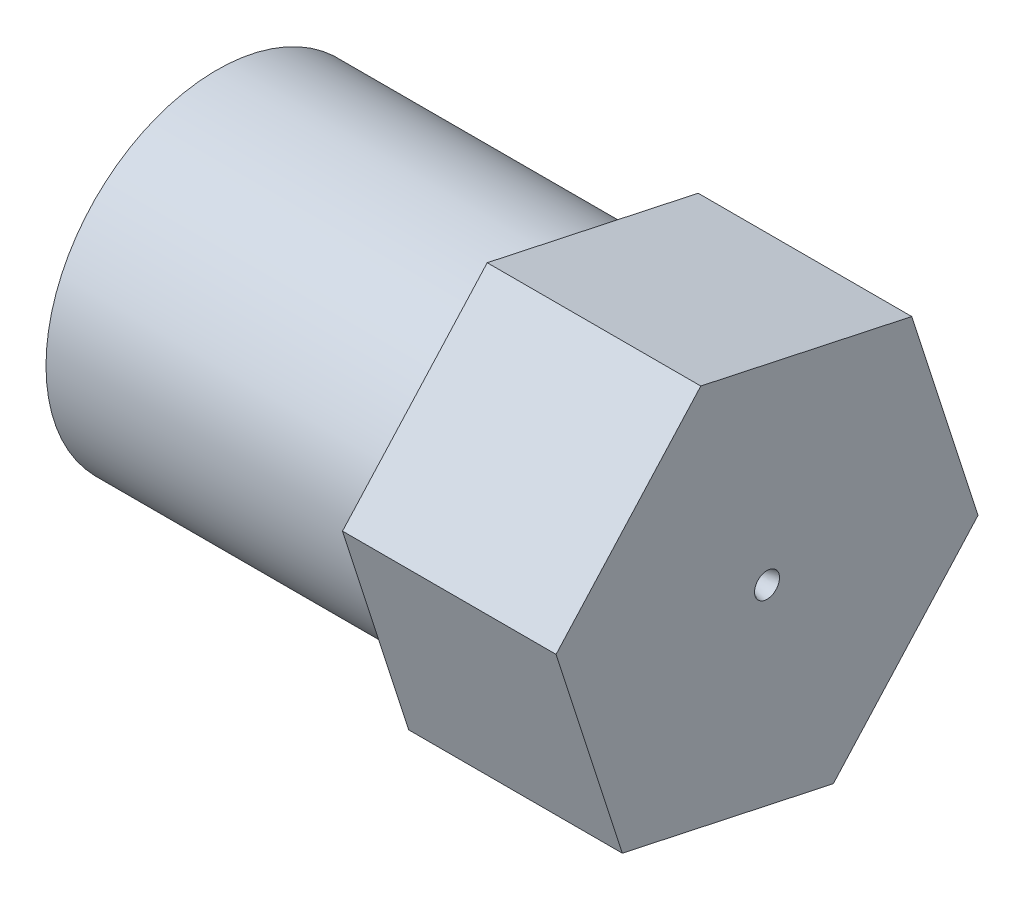
ISO-10303-21;
HEADER;
FILE_DESCRIPTION(('STEP AP214'),'2;1');
FILE_NAME('part.step','',(''),(''),'','','');
FILE_SCHEMA(('AUTOMOTIVE_DESIGN { 1 0 10303 214 1 1 1 1 }'));
ENDSEC;
DATA;
#1=APPLICATION_CONTEXT('core data for automotive mechanical design processes');
#2=APPLICATION_PROTOCOL_DEFINITION('international standard','automotive_design',2000,#1);
#3=PRODUCT_CONTEXT('',#1,'mechanical');
#4=PRODUCT('Part','Part','',(#3));
#5=PRODUCT_RELATED_PRODUCT_CATEGORY('part','',(#4));
#6=PRODUCT_DEFINITION_FORMATION('','',#4);
#7=PRODUCT_DEFINITION_CONTEXT('part definition',#1,'design');
#8=PRODUCT_DEFINITION('design','',#6,#7);
#9=PRODUCT_DEFINITION_SHAPE('','',#8);
#10=(LENGTH_UNIT() NAMED_UNIT(*) SI_UNIT(.MILLI.,.METRE.));
#11=(NAMED_UNIT(*) PLANE_ANGLE_UNIT() SI_UNIT($,.RADIAN.));
#12=(NAMED_UNIT(*) SI_UNIT($,.STERADIAN.) SOLID_ANGLE_UNIT());
#13=UNCERTAINTY_MEASURE_WITH_UNIT(LENGTH_MEASURE(1.E-05),#10,'distance_accuracy_value','');
#14=(GEOMETRIC_REPRESENTATION_CONTEXT(3) GLOBAL_UNCERTAINTY_ASSIGNED_CONTEXT((#13)) GLOBAL_UNIT_ASSIGNED_CONTEXT((#10,
#11,#12)) REPRESENTATION_CONTEXT('',''));
#15=CARTESIAN_POINT('',(0.,0.,0.));
#16=DIRECTION('',(0.,0.,1.));
#17=DIRECTION('',(1.,0.,0.));
#18=AXIS2_PLACEMENT_3D('',#15,#16,#17);
#19=CARTESIAN_POINT('',(0.,0.,0.));
#20=DIRECTION('',(-1.,0.,0.));
#21=DIRECTION('',(0.,0.,1.));
#22=AXIS2_PLACEMENT_3D('',#19,#20,#21);
#23=CYLINDRICAL_SURFACE('',#22,10.16);
#24=CARTESIAN_POINT('',(-12.3654914657986,0.,0.));
#25=DIRECTION('',(1.,0.,0.));
#26=DIRECTION('',(0.,0.,-1.));
#27=AXIS2_PLACEMENT_3D('',#24,#25,#26);
#28=CIRCLE('',#27,10.16);
#29=CARTESIAN_POINT('',(-12.3654914657986,0.,-10.16));
#30=VERTEX_POINT('',#29);
#31=EDGE_CURVE('E11',#30,#30,#28,.F.);
#32=ORIENTED_EDGE('',*,*,#31,.T.);
#33=EDGE_LOOP('',(#32));
#34=FACE_BOUND('',#33,.T.);
#35=CARTESIAN_POINT('',(-31.75,0.,0.));
#36=DIRECTION('',(-1.,0.,0.));
#37=DIRECTION('',(0.,0.,1.));
#38=AXIS2_PLACEMENT_3D('',#35,#36,#37);
#39=CIRCLE('',#38,10.16);
#40=CARTESIAN_POINT('',(-31.75,0.,10.16));
#41=VERTEX_POINT('',#40);
#42=EDGE_CURVE('E232',#41,#41,#39,.T.);
#43=ORIENTED_EDGE('',*,*,#42,.F.);
#44=EDGE_LOOP('',(#43));
#45=FACE_BOUND('',#44,.T.);
#46=ADVANCED_FACE('F41',(#34,#45),#23,.T.);
#47=CARTESIAN_POINT('',(0.,0.,0.));
#48=DIRECTION('',(-1.,0.,0.));
#49=DIRECTION('',(0.,0.,1.));
#50=AXIS2_PLACEMENT_3D('',#47,#48,#49);
#51=TOROIDAL_SURFACE('',#50,1.25,0.75);
#52=CARTESIAN_POINT('',(0.,0.,0.));
#53=DIRECTION('',(-1.,0.,0.));
#54=DIRECTION('',(0.,0.,1.));
#55=AXIS2_PLACEMENT_3D('',#52,#53,#54);
#56=CIRCLE('',#55,0.5);
#57=CARTESIAN_POINT('',(0.,0.,0.5));
#58=VERTEX_POINT('',#57);
#59=EDGE_CURVE('E183',#58,#58,#56,.T.);
#60=ORIENTED_EDGE('',*,*,#59,.F.);
#61=EDGE_LOOP('',(#60));
#62=FACE_BOUND('',#61,.T.);
#63=CARTESIAN_POINT('',(-0.530330085882663,0.,0.));
#64=DIRECTION('',(-1.,0.,0.));
#65=DIRECTION('',(0.,0.,1.));
#66=AXIS2_PLACEMENT_3D('',#63,#64,#65);
#67=CIRCLE('',#66,0.719669914102842);
#68=CARTESIAN_POINT('',(-0.530330085882664,0.,0.719669914102843));
#69=VERTEX_POINT('',#68);
#70=EDGE_CURVE('E148',#69,#69,#67,.T.);
#71=ORIENTED_EDGE('',*,*,#70,.T.);
#72=EDGE_LOOP('',(#71));
#73=FACE_BOUND('',#72,.T.);
#74=ADVANCED_FACE('F172',(#62,#73),#51,.T.);
#75=CARTESIAN_POINT('',(0.,0.,0.));
#76=DIRECTION('',(-1.,0.,0.));
#77=DIRECTION('',(0.,0.,1.));
#78=AXIS2_PLACEMENT_3D('',#75,#76,#77);
#79=TOROIDAL_SURFACE('',#78,0.7,0.2);
#80=CARTESIAN_POINT('',(0.068404028681357,0.,0.));
#81=DIRECTION('',(-1.,0.,0.));
#82=DIRECTION('',(0.,0.,1.));
#83=AXIS2_PLACEMENT_3D('',#80,#81,#82);
#84=CIRCLE('',#83,0.512061475888004);
#85=CARTESIAN_POINT('',(0.068404028681357,0.,0.512061475888004));
#86=VERTEX_POINT('',#85);
#87=EDGE_CURVE('E239',#86,#86,#84,.T.);
#88=ORIENTED_EDGE('',*,*,#87,.F.);
#89=EDGE_LOOP('',(#88));
#90=FACE_BOUND('',#89,.T.);
#91=ORIENTED_EDGE('',*,*,#59,.T.);
#92=EDGE_LOOP('',(#91));
#93=FACE_BOUND('',#92,.T.);
#94=ADVANCED_FACE('F168',(#90,#93),#79,.T.);
#95=CARTESIAN_POINT('',(351520.509195519,-936184.058741263,0.));
#96=CARTESIAN_POINT('',(-354193.542431165,935172.627793937,0.));
#97=CARTESIAN_POINT('',(356866.849282926,-934159.148600707,0.));
#98=B_SPLINE_CURVE_WITH_KNOTS('',2,(#95,#96,#97),.UNSPECIFIED.,.F.,.F.,(3,3),(0.,1.),.UNSPECIFIED.);
#99=CARTESIAN_POINT('',(0.,0.,0.));
#100=DIRECTION('',(-1.,0.,0.));
#101=AXIS1_PLACEMENT('',#99,#100);
#102=SURFACE_OF_REVOLUTION('',#98,#101);
#103=CARTESIAN_POINT('',(0.969508534201359,0.,0.));
#104=DIRECTION('',(-1.,0.,0.));
#105=DIRECTION('',(0.,0.,1.));
#106=AXIS2_PLACEMENT_3D('',#103,#104,#105);
#107=CIRCLE('',#106,0.741619848709566);
#108=CARTESIAN_POINT('',(0.969508534201359,0.,0.741619848709566));
#109=VERTEX_POINT('',#108);
#110=EDGE_CURVE('E235',#109,#109,#107,.T.);
#111=ORIENTED_EDGE('',*,*,#110,.F.);
#112=EDGE_LOOP('',(#111));
#113=FACE_BOUND('',#112,.T.);
#114=ORIENTED_EDGE('',*,*,#87,.T.);
#115=EDGE_LOOP('',(#114));
#116=FACE_BOUND('',#115,.T.);
#117=ADVANCED_FACE('F163',(#113,#116),#102,.T.);
#118=CARTESIAN_POINT('',(0.969508534201359,10.16,0.));
#119=DIRECTION('',(-1.,0.,0.));
#120=DIRECTION('',(0.,0.,1.));
#121=AXIS2_PLACEMENT_3D('',#118,#119,#120);
#122=PLANE('',#121);
#123=ORIENTED_EDGE('',*,*,#110,.T.);
#124=EDGE_LOOP('',(#123));
#125=FACE_BOUND('',#124,.T.);
#126=DIRECTION('',(0.,-0.951681663898051,-0.307086324345838));
#127=VECTOR('',#126,1.);
#128=CARTESIAN_POINT('',(0.969508534201359,-3.41249677929312,10.5755624900671));
#129=LINE('',#128,#127);
#130=CARTESIAN_POINT('',(0.969508534201359,2.69330707117882,12.5457684242007));
#131=VERTEX_POINT('',#130);
#132=CARTESIAN_POINT('',(0.969508534201359,-9.51830062976507,8.60535655593348));
#133=VERTEX_POINT('',#132);
#134=EDGE_CURVE('E129',#131,#133,#129,.T.);
#135=ORIENTED_EDGE('',*,*,#134,.T.);
#136=DIRECTION('',(0.,-0.209896273910742,-0.977723659424475));
#137=VECTOR('',#136,1.);
#138=CARTESIAN_POINT('',(0.969508534201359,-10.8649541653545,2.33247234383312));
#139=LINE('',#138,#137);
#140=CARTESIAN_POINT('',(0.969508534201359,-12.2116077009439,-3.94041186826723));
#141=VERTEX_POINT('',#140);
#142=EDGE_CURVE('E133',#133,#141,#139,.T.);
#143=ORIENTED_EDGE('',*,*,#142,.T.);
#144=DIRECTION('',(0.,0.741785389987309,-0.670637335078637));
#145=VECTOR('',#144,1.);
#146=CARTESIAN_POINT('',(0.969508534201359,-7.45245738606136,-8.24309014623397));
#147=LINE('',#146,#145);
#148=CARTESIAN_POINT('',(0.969508534201359,-2.69330707117882,-12.5457684242007));
#149=VERTEX_POINT('',#148);
#150=EDGE_CURVE('E136',#141,#149,#147,.T.);
#151=ORIENTED_EDGE('',*,*,#150,.T.);
#152=DIRECTION('',(0.,0.951681663898051,0.307086324345838));
#153=VECTOR('',#152,1.);
#154=CARTESIAN_POINT('',(0.969508534201359,3.41249677929312,-10.5755624900671));
#155=LINE('',#154,#153);
#156=CARTESIAN_POINT('',(0.969508534201359,9.51830062976506,-8.60535655593348));
#157=VERTEX_POINT('',#156);
#158=EDGE_CURVE('E139',#149,#157,#155,.T.);
#159=ORIENTED_EDGE('',*,*,#158,.T.);
#160=DIRECTION('',(0.,0.209896273910742,0.977723659424475));
#161=VECTOR('',#160,1.);
#162=CARTESIAN_POINT('',(0.969508534201359,10.8649541653545,-2.33247234383312));
#163=LINE('',#162,#161);
#164=CARTESIAN_POINT('',(0.969508534201359,12.2116077009439,3.94041186826724));
#165=VERTEX_POINT('',#164);
#166=EDGE_CURVE('E106',#157,#165,#163,.T.);
#167=ORIENTED_EDGE('',*,*,#166,.T.);
#168=DIRECTION('',(0.,-0.741785389987309,0.670637335078637));
#169=VECTOR('',#168,1.);
#170=CARTESIAN_POINT('',(0.969508534201359,7.45245738606136,8.24309014623397));
#171=LINE('',#170,#169);
#172=EDGE_CURVE('E143',#165,#131,#171,.T.);
#173=ORIENTED_EDGE('',*,*,#172,.T.);
#174=EDGE_LOOP('',(#135,#143,#151,#159,#167,#173));
#175=FACE_BOUND('',#174,.T.);
#176=ADVANCED_FACE('F167',(#125,#175),#122,.F.);
#177=CARTESIAN_POINT('',(-31.75,10.16,0.));
#178=DIRECTION('',(1.,0.,0.));
#179=DIRECTION('',(0.,0.,-1.));
#180=AXIS2_PLACEMENT_3D('',#177,#178,#179);
#181=PLANE('',#180);
#182=CARTESIAN_POINT('',(-31.75,0.,0.));
#183=DIRECTION('',(-1.,0.,0.));
#184=DIRECTION('',(0.,0.,1.));
#185=AXIS2_PLACEMENT_3D('',#182,#183,#184);
#186=CIRCLE('',#185,8.6614);
#187=CARTESIAN_POINT('',(-31.75,0.,8.6614));
#188=VERTEX_POINT('',#187);
#189=EDGE_CURVE('E229',#188,#188,#186,.T.);
#190=ORIENTED_EDGE('',*,*,#189,.F.);
#191=EDGE_LOOP('',(#190));
#192=FACE_BOUND('',#191,.T.);
#193=ORIENTED_EDGE('',*,*,#42,.T.);
#194=EDGE_LOOP('',(#193));
#195=FACE_BOUND('',#194,.T.);
#196=ADVANCED_FACE('F259',(#192,#195),#181,.F.);
#197=CARTESIAN_POINT('',(-31.115,0.,0.));
#198=DIRECTION('',(-1.,0.,0.));
#199=DIRECTION('',(0.,0.,1.));
#200=AXIS2_PLACEMENT_3D('',#197,#198,#199);
#201=TOROIDAL_SURFACE('',#200,8.6614,0.635);
#202=CARTESIAN_POINT('',(-31.115,0.,0.));
#203=DIRECTION('',(-1.,0.,0.));
#204=DIRECTION('',(0.,0.,1.));
#205=AXIS2_PLACEMENT_3D('',#202,#203,#204);
#206=CIRCLE('',#205,8.02639999999999);
#207=CARTESIAN_POINT('',(-31.115,0.,8.02639999999999));
#208=VERTEX_POINT('',#207);
#209=EDGE_CURVE('E226',#208,#208,#206,.T.);
#210=ORIENTED_EDGE('',*,*,#209,.F.);
#211=EDGE_LOOP('',(#210));
#212=FACE_BOUND('',#211,.T.);
#213=ORIENTED_EDGE('',*,*,#189,.T.);
#214=EDGE_LOOP('',(#213));
#215=FACE_BOUND('',#214,.T.);
#216=ADVANCED_FACE('F261',(#212,#215),#201,.T.);
#217=CARTESIAN_POINT('',(0.,0.,0.));
#218=DIRECTION('',(-1.,0.,0.));
#219=DIRECTION('',(0.,0.,1.));
#220=AXIS2_PLACEMENT_3D('',#217,#218,#219);
#221=CYLINDRICAL_SURFACE('',#220,8.02639999999999);
#222=CARTESIAN_POINT('',(-25.019,0.,0.));
#223=DIRECTION('',(-1.,0.,0.));
#224=DIRECTION('',(0.,0.,1.));
#225=AXIS2_PLACEMENT_3D('',#222,#223,#224);
#226=CIRCLE('',#225,8.02639999999999);
#227=CARTESIAN_POINT('',(-25.019,0.,8.02639999999999));
#228=VERTEX_POINT('',#227);
#229=EDGE_CURVE('E223',#228,#228,#226,.T.);
#230=ORIENTED_EDGE('',*,*,#229,.F.);
#231=EDGE_LOOP('',(#230));
#232=FACE_BOUND('',#231,.T.);
#233=ORIENTED_EDGE('',*,*,#209,.T.);
#234=EDGE_LOOP('',(#233));
#235=FACE_BOUND('',#234,.T.);
#236=ADVANCED_FACE('F268',(#232,#235),#221,.F.);
#237=CARTESIAN_POINT('',(-25.019,0.,0.));
#238=DIRECTION('',(-1.,0.,0.));
#239=DIRECTION('',(0.,0.,1.));
#240=AXIS2_PLACEMENT_3D('',#237,#238,#239);
#241=TOROIDAL_SURFACE('',#240,7.89939999999999,0.127);
#242=CARTESIAN_POINT('',(-24.892,0.,0.));
#243=DIRECTION('',(-1.,0.,0.));
#244=DIRECTION('',(0.,0.,1.));
#245=AXIS2_PLACEMENT_3D('',#242,#243,#244);
#246=CIRCLE('',#245,7.89939999999999);
#247=CARTESIAN_POINT('',(-24.892,0.,7.89939999999999));
#248=VERTEX_POINT('',#247);
#249=EDGE_CURVE('E220',#248,#248,#246,.T.);
#250=ORIENTED_EDGE('',*,*,#249,.F.);
#251=EDGE_LOOP('',(#250));
#252=FACE_BOUND('',#251,.T.);
#253=ORIENTED_EDGE('',*,*,#229,.T.);
#254=EDGE_LOOP('',(#253));
#255=FACE_BOUND('',#254,.T.);
#256=ADVANCED_FACE('F276',(#252,#255),#241,.F.);
#257=CARTESIAN_POINT('',(-24.892,6.9469,0.));
#258=DIRECTION('',(1.,0.,0.));
#259=DIRECTION('',(0.,0.,-1.));
#260=AXIS2_PLACEMENT_3D('',#257,#258,#259);
#261=PLANE('',#260);
#262=CARTESIAN_POINT('',(-24.892,0.,0.));
#263=DIRECTION('',(-1.,0.,0.));
#264=DIRECTION('',(0.,0.,1.));
#265=AXIS2_PLACEMENT_3D('',#262,#263,#264);
#266=CIRCLE('',#265,6.9469);
#267=CARTESIAN_POINT('',(-24.892,0.,6.9469));
#268=VERTEX_POINT('',#267);
#269=EDGE_CURVE('E217',#268,#268,#266,.T.);
#270=ORIENTED_EDGE('',*,*,#269,.F.);
#271=EDGE_LOOP('',(#270));
#272=FACE_BOUND('',#271,.T.);
#273=ORIENTED_EDGE('',*,*,#249,.T.);
#274=EDGE_LOOP('',(#273));
#275=FACE_BOUND('',#274,.T.);
#276=ADVANCED_FACE('F280',(#272,#275),#261,.F.);
#277=CARTESIAN_POINT('',(0.,0.,0.));
#278=DIRECTION('',(-1.,0.,0.));
#279=DIRECTION('',(0.,0.,1.));
#280=AXIS2_PLACEMENT_3D('',#277,#278,#279);
#281=CYLINDRICAL_SURFACE('',#280,6.9469);
#282=CARTESIAN_POINT('',(-20.066,0.,0.));
#283=DIRECTION('',(-1.,0.,0.));
#284=DIRECTION('',(0.,0.,1.));
#285=AXIS2_PLACEMENT_3D('',#282,#283,#284);
#286=CIRCLE('',#285,6.9469);
#287=CARTESIAN_POINT('',(-20.066,0.,6.9469));
#288=VERTEX_POINT('',#287);
#289=EDGE_CURVE('E214',#288,#288,#286,.T.);
#290=ORIENTED_EDGE('',*,*,#289,.F.);
#291=EDGE_LOOP('',(#290));
#292=FACE_BOUND('',#291,.T.);
#293=ORIENTED_EDGE('',*,*,#269,.T.);
#294=EDGE_LOOP('',(#293));
#295=FACE_BOUND('',#294,.T.);
#296=ADVANCED_FACE('F284',(#292,#295),#281,.F.);
#297=CARTESIAN_POINT('',(-20.066,0.,0.));
#298=DIRECTION('',(-1.,0.,0.));
#299=DIRECTION('',(0.,0.,1.));
#300=AXIS2_PLACEMENT_3D('',#297,#298,#299);
#301=TOROIDAL_SURFACE('',#300,6.8199,0.127);
#302=CARTESIAN_POINT('',(-19.939,0.,0.));
#303=DIRECTION('',(-1.,0.,0.));
#304=DIRECTION('',(0.,0.,1.));
#305=AXIS2_PLACEMENT_3D('',#302,#303,#304);
#306=CIRCLE('',#305,6.8199);
#307=CARTESIAN_POINT('',(-19.939,0.,6.8199));
#308=VERTEX_POINT('',#307);
#309=EDGE_CURVE('E211',#308,#308,#306,.T.);
#310=ORIENTED_EDGE('',*,*,#309,.F.);
#311=EDGE_LOOP('',(#310));
#312=FACE_BOUND('',#311,.T.);
#313=ORIENTED_EDGE('',*,*,#289,.T.);
#314=EDGE_LOOP('',(#313));
#315=FACE_BOUND('',#314,.T.);
#316=ADVANCED_FACE('F288',(#312,#315),#301,.F.);
#317=CARTESIAN_POINT('',(-19.939,5.46100000000001,0.));
#318=DIRECTION('',(1.,0.,0.));
#319=DIRECTION('',(0.,0.,-1.));
#320=AXIS2_PLACEMENT_3D('',#317,#318,#319);
#321=PLANE('',#320);
#322=CARTESIAN_POINT('',(-19.939,0.,0.));
#323=DIRECTION('',(-1.,0.,0.));
#324=DIRECTION('',(0.,0.,1.));
#325=AXIS2_PLACEMENT_3D('',#322,#323,#324);
#326=CIRCLE('',#325,5.46100000000001);
#327=CARTESIAN_POINT('',(-19.939,0.,5.46100000000001));
#328=VERTEX_POINT('',#327);
#329=EDGE_CURVE('E208',#328,#328,#326,.T.);
#330=ORIENTED_EDGE('',*,*,#329,.F.);
#331=EDGE_LOOP('',(#330));
#332=FACE_BOUND('',#331,.T.);
#333=ORIENTED_EDGE('',*,*,#309,.T.);
#334=EDGE_LOOP('',(#333));
#335=FACE_BOUND('',#334,.T.);
#336=ADVANCED_FACE('F292',(#332,#335),#321,.F.);
#337=CARTESIAN_POINT('',(-19.304,0.,0.));
#338=DIRECTION('',(-1.,0.,0.));
#339=DIRECTION('',(0.,0.,1.));
#340=AXIS2_PLACEMENT_3D('',#337,#338,#339);
#341=TOROIDAL_SURFACE('',#340,5.461,0.635);
#342=CARTESIAN_POINT('',(-19.304,0.,0.));
#343=DIRECTION('',(-1.,0.,0.));
#344=DIRECTION('',(0.,0.,1.));
#345=AXIS2_PLACEMENT_3D('',#342,#343,#344);
#346=CIRCLE('',#345,4.826);
#347=CARTESIAN_POINT('',(-19.304,0.,4.826));
#348=VERTEX_POINT('',#347);
#349=EDGE_CURVE('E205',#348,#348,#346,.T.);
#350=ORIENTED_EDGE('',*,*,#349,.F.);
#351=EDGE_LOOP('',(#350));
#352=FACE_BOUND('',#351,.T.);
#353=ORIENTED_EDGE('',*,*,#329,.T.);
#354=EDGE_LOOP('',(#353));
#355=FACE_BOUND('',#354,.T.);
#356=ADVANCED_FACE('F296',(#352,#355),#341,.T.);
#357=CARTESIAN_POINT('',(0.,0.,0.));
#358=DIRECTION('',(-1.,0.,0.));
#359=DIRECTION('',(0.,0.,1.));
#360=AXIS2_PLACEMENT_3D('',#357,#358,#359);
#361=CYLINDRICAL_SURFACE('',#360,4.826);
#362=CARTESIAN_POINT('',(-13.589,0.,0.));
#363=DIRECTION('',(-1.,0.,0.));
#364=DIRECTION('',(0.,0.,1.));
#365=AXIS2_PLACEMENT_3D('',#362,#363,#364);
#366=CIRCLE('',#365,4.826);
#367=CARTESIAN_POINT('',(-13.589,0.,4.826));
#368=VERTEX_POINT('',#367);
#369=EDGE_CURVE('E202',#368,#368,#366,.T.);
#370=ORIENTED_EDGE('',*,*,#369,.F.);
#371=EDGE_LOOP('',(#370));
#372=FACE_BOUND('',#371,.T.);
#373=ORIENTED_EDGE('',*,*,#349,.T.);
#374=EDGE_LOOP('',(#373));
#375=FACE_BOUND('',#374,.T.);
#376=ADVANCED_FACE('F300',(#372,#375),#361,.F.);
#377=CARTESIAN_POINT('',(-13.589,0.,0.));
#378=DIRECTION('',(-1.,0.,0.));
#379=DIRECTION('',(0.,0.,1.));
#380=AXIS2_PLACEMENT_3D('',#377,#378,#379);
#381=TOROIDAL_SURFACE('',#380,4.699,0.127);
#382=CARTESIAN_POINT('',(-13.462,0.,0.));
#383=DIRECTION('',(-1.,0.,0.));
#384=DIRECTION('',(0.,0.,1.));
#385=AXIS2_PLACEMENT_3D('',#382,#383,#384);
#386=CIRCLE('',#385,4.699);
#387=CARTESIAN_POINT('',(-13.462,0.,4.699));
#388=VERTEX_POINT('',#387);
#389=EDGE_CURVE('E199',#388,#388,#386,.T.);
#390=ORIENTED_EDGE('',*,*,#389,.F.);
#391=EDGE_LOOP('',(#390));
#392=FACE_BOUND('',#391,.T.);
#393=ORIENTED_EDGE('',*,*,#369,.T.);
#394=EDGE_LOOP('',(#393));
#395=FACE_BOUND('',#394,.T.);
#396=ADVANCED_FACE('F304',(#392,#395),#381,.F.);
#397=CARTESIAN_POINT('',(-13.462,4.445,0.));
#398=DIRECTION('',(1.,0.,0.));
#399=DIRECTION('',(0.,0.,-1.));
#400=AXIS2_PLACEMENT_3D('',#397,#398,#399);
#401=PLANE('',#400);
#402=CARTESIAN_POINT('',(-13.462,0.,0.));
#403=DIRECTION('',(-1.,0.,0.));
#404=DIRECTION('',(0.,0.,1.));
#405=AXIS2_PLACEMENT_3D('',#402,#403,#404);
#406=CIRCLE('',#405,4.445);
#407=CARTESIAN_POINT('',(-13.462,0.,4.445));
#408=VERTEX_POINT('',#407);
#409=EDGE_CURVE('E194',#408,#408,#406,.T.);
#410=ORIENTED_EDGE('',*,*,#409,.F.);
#411=EDGE_LOOP('',(#410));
#412=FACE_BOUND('',#411,.T.);
#413=ORIENTED_EDGE('',*,*,#389,.T.);
#414=EDGE_LOOP('',(#413));
#415=FACE_BOUND('',#414,.T.);
#416=ADVANCED_FACE('F308',(#412,#415),#401,.F.);
#417=CARTESIAN_POINT('',(0.,0.,0.));
#418=DIRECTION('',(-1.,0.,0.));
#419=DIRECTION('',(0.,0.,1.));
#420=AXIS2_PLACEMENT_3D('',#417,#418,#419);
#421=CYLINDRICAL_SURFACE('',#420,4.4449999999865);
#422=CARTESIAN_POINT('',(-5.57078823236844,0.,0.));
#423=DIRECTION('',(-1.,0.,0.));
#424=DIRECTION('',(0.,0.,1.));
#425=AXIS2_PLACEMENT_3D('',#422,#423,#424);
#426=CIRCLE('',#425,4.44499999997301);
#427=CARTESIAN_POINT('',(-5.57078823236844,0.,4.44499999997301));
#428=VERTEX_POINT('',#427);
#429=EDGE_CURVE('E190',#428,#428,#426,.T.);
#430=ORIENTED_EDGE('',*,*,#429,.F.);
#431=EDGE_LOOP('',(#430));
#432=FACE_BOUND('',#431,.T.);
#433=ORIENTED_EDGE('',*,*,#409,.T.);
#434=EDGE_LOOP('',(#433));
#435=FACE_BOUND('',#434,.T.);
#436=ADVANCED_FACE('F312',(#432,#435),#421,.F.);
#437=CARTESIAN_POINT('',(-5.57078823231446,0.,0.));
#438=DIRECTION('',(-1.,0.,0.));
#439=DIRECTION('',(0.,0.,1.));
#440=AXIS2_PLACEMENT_3D('',#437,#438,#439);
#441=DEGENERATE_TOROIDAL_SURFACE('',#440,1.27,3.17499999997301,.T.);
#442=CARTESIAN_POINT('',(-3.32572420217,0.,0.));
#443=DIRECTION('',(-1.,0.,0.));
#444=DIRECTION('',(0.,0.,1.));
#445=AXIS2_PLACEMENT_3D('',#442,#443,#444);
#446=CIRCLE('',#445,3.51506403031378);
#447=CARTESIAN_POINT('',(-3.32572420217,0.,3.51506403031378));
#448=VERTEX_POINT('',#447);
#449=EDGE_CURVE('E188',#448,#448,#446,.T.);
#450=ORIENTED_EDGE('',*,*,#449,.F.);
#451=EDGE_LOOP('',(#450));
#452=FACE_BOUND('',#451,.T.);
#453=ORIENTED_EDGE('',*,*,#429,.T.);
#454=EDGE_LOOP('',(#453));
#455=FACE_BOUND('',#454,.T.);
#456=ADVANCED_FACE('F316',(#452,#455),#441,.F.);
#457=CARTESIAN_POINT('',(-3.32572420217,0.,0.));
#458=DIRECTION('',(-1.,0.,0.));
#459=DIRECTION('',(0.,0.,1.));
#460=AXIS2_PLACEMENT_3D('',#457,#458,#459);
#461=CONICAL_SURFACE('',#460,3.51506403031378,0.785398163383783);
#462=CARTESIAN_POINT('',(-0.530330085882664,0.,0.719669914102843));
#463=CARTESIAN_POINT('',(-0.55944877459399,0.,0.748788602813373));
#464=CARTESIAN_POINT('',(-0.588567463305317,0.,0.777907291523904));
#465=CARTESIAN_POINT('',(-0.646804840727969,0.,0.836144668944965));
#466=CARTESIAN_POINT('',(-0.675923529439296,0.,0.865263357655495));
#467=CARTESIAN_POINT('',(-0.734160906861949,0.,0.923500735076557));
#468=CARTESIAN_POINT('',(-0.763279595573275,0.,0.952619423787088));
#469=CARTESIAN_POINT('',(-0.821516972995928,0.,1.01085680120815));
#470=CARTESIAN_POINT('',(-0.850635661707254,0.,1.03997548991868));
#471=CARTESIAN_POINT('',(-0.908873039129907,0.,1.09821286733974));
#472=CARTESIAN_POINT('',(-0.937991727841234,0.,1.12733155605027));
#473=CARTESIAN_POINT('',(-0.996229105263886,0.,1.18556893347133));
#474=CARTESIAN_POINT('',(-1.02534779397521,0.,1.21468762218186));
#475=CARTESIAN_POINT('',(-1.08358517139787,0.,1.27292499960292));
#476=CARTESIAN_POINT('',(-1.11270386010919,0.,1.30204368831345));
#477=CARTESIAN_POINT('',(-1.17094123753184,0.,1.36028106573452));
#478=CARTESIAN_POINT('',(-1.20005992624317,0.,1.38939975444505));
#479=CARTESIAN_POINT('',(-1.25829730366582,0.,1.44763713186611));
#480=CARTESIAN_POINT('',(-1.28741599237715,0.,1.47675582057664));
#481=CARTESIAN_POINT('',(-1.3456533697998,0.,1.5349931979977));
#482=CARTESIAN_POINT('',(-1.37477205851113,0.,1.56411188670823));
#483=CARTESIAN_POINT('',(-1.43300943593378,0.,1.62234926412929));
#484=CARTESIAN_POINT('',(-1.46212812464511,0.,1.65146795283982));
#485=CARTESIAN_POINT('',(-1.52036550206776,0.,1.70970533026088));
#486=CARTESIAN_POINT('',(-1.54948419077909,0.,1.73882401897141));
#487=CARTESIAN_POINT('',(-1.60772156820174,0.,1.79706139639247));
#488=CARTESIAN_POINT('',(-1.63684025691307,0.,1.826180085103));
#489=CARTESIAN_POINT('',(-1.69507763433572,0.,1.88441746252407));
#490=CARTESIAN_POINT('',(-1.72419632304705,0.,1.9135361512346));
#491=CARTESIAN_POINT('',(-1.7824337004697,0.,1.97177352865566));
#492=CARTESIAN_POINT('',(-1.81155238918103,0.,2.00089221736619));
#493=CARTESIAN_POINT('',(-1.86978976660368,0.,2.05912959478725));
#494=CARTESIAN_POINT('',(-1.89890845531501,0.,2.08824828349778));
#495=CARTESIAN_POINT('',(-1.95714583273766,0.,2.14648566091884));
#496=CARTESIAN_POINT('',(-1.98626452144898,0.,2.17560434962937));
#497=CARTESIAN_POINT('',(-2.04450189887164,0.,2.23384172705043));
#498=CARTESIAN_POINT('',(-2.07362058758296,0.,2.26296041576096));
#499=CARTESIAN_POINT('',(-2.13185796500562,0.,2.32119779318202));
#500=CARTESIAN_POINT('',(-2.16097665371694,0.,2.35031648189255));
#501=CARTESIAN_POINT('',(-2.2192140311396,0.,2.40855385931362));
#502=CARTESIAN_POINT('',(-2.24833271985092,0.,2.43767254802415));
#503=CARTESIAN_POINT('',(-2.30657009727358,0.,2.49590992544521));
#504=CARTESIAN_POINT('',(-2.3356887859849,0.,2.52502861415574));
#505=CARTESIAN_POINT('',(-2.39392616340755,0.,2.5832659915768));
#506=CARTESIAN_POINT('',(-2.42304485211888,0.,2.61238468028733));
#507=CARTESIAN_POINT('',(-2.48128222954153,0.,2.67062205770839));
#508=CARTESIAN_POINT('',(-2.51040091825286,0.,2.69974074641892));
#509=CARTESIAN_POINT('',(-2.56863829567551,0.,2.75797812383998));
#510=CARTESIAN_POINT('',(-2.59775698438684,0.,2.78709681255051));
#511=CARTESIAN_POINT('',(-2.65599436180949,0.,2.84533418997157));
#512=CARTESIAN_POINT('',(-2.68511305052082,0.,2.8744528786821));
#513=CARTESIAN_POINT('',(-2.74335042794347,0.,2.93269025610317));
#514=CARTESIAN_POINT('',(-2.7724691166548,0.,2.9618089448137));
#515=CARTESIAN_POINT('',(-2.83070649407745,0.,3.02004632223476));
#516=CARTESIAN_POINT('',(-2.85982518278878,0.,3.04916501094529));
#517=CARTESIAN_POINT('',(-2.91806256021143,0.,3.10740238836635));
#518=CARTESIAN_POINT('',(-2.94718124892276,0.,3.13652107707688));
#519=CARTESIAN_POINT('',(-3.00541862634541,0.,3.19475845449794));
#520=CARTESIAN_POINT('',(-3.03453731505674,0.,3.22387714320847));
#521=CARTESIAN_POINT('',(-3.09277469247939,0.,3.28211452062953));
#522=CARTESIAN_POINT('',(-3.12189338119072,0.,3.31123320934006));
#523=CARTESIAN_POINT('',(-3.18013075861337,0.,3.36947058676112));
#524=CARTESIAN_POINT('',(-3.20924944732469,0.,3.39858927547166));
#525=CARTESIAN_POINT('',(-3.26748682474735,0.,3.45682665289272));
#526=CARTESIAN_POINT('',(-3.29660551345867,0.,3.48594534160325));
#527=CARTESIAN_POINT('',(-3.32572420217,0.,3.51506403031378));
#528=B_SPLINE_CURVE_WITH_KNOTS('',3,(#462,#463,#464,#465,#466,#467,#468,#469,#470,#471,#472,
#473,#474,#475,#476,#477,#478,#479,#480,#481,#482,#483,#484,#485,#486,#487,#488,#489,#490,#491,
#492,#493,#494,#495,#496,#497,#498,#499,#500,#501,#502,#503,#504,#505,#506,#507,#508,#509,#510,
#511,#512,#513,#514,#515,#516,#517,#518,#519,#520,#521,#522,#523,#524,#525,#526,#527),
.UNSPECIFIED.,.F.,.F.,(4,2,2,2,2,2,2,2,2,2,2,2,2,2,2,2,2,2,2,2,2,2,2,2,2,2,2,2,2,2,2,2,4),(0.,
0.123540133480546,0.247080266961092,0.370620400441639,0.494160533922185,0.617700667402731,
0.741240800883277,0.864780934363823,0.98832106784437,1.11186120132492,1.23540133480546,
1.35894146828601,1.48248160176655,1.6060217352471,1.72956186872765,1.85310200220819,
1.97664213568874,2.10018226916929,2.22372240264983,2.34726253613038,2.47080266961092,
2.59434280309147,2.71788293657202,2.84142307005256,2.96496320353311,3.08850333701365,
3.2120434704942,3.33558360397475,3.45912373745529,3.58266387093584,3.70620400441639,
3.82974413789693,3.95328427137748),.UNSPECIFIED.);
#529=EDGE_CURVE('BSEAM320',#69,#448,#528,.T.);
#530=ORIENTED_EDGE('',*,*,#70,.F.);
#531=ORIENTED_EDGE('',*,*,#449,.T.);
#532=ORIENTED_EDGE('',*,*,#529,.T.);
#533=ORIENTED_EDGE('',*,*,#529,.F.);
#534=EDGE_LOOP('',(#530,#532,#531,#533));
#535=FACE_BOUND('',#534,.T.);
#536=ADVANCED_FACE('F320',(#535),#461,.F.);
#537=CARTESIAN_POINT('',(-11.7304914657986,-3.41249677929312,10.5755624900671));
#538=DIRECTION('',(0.,-0.307086324345838,0.951681663898051));
#539=DIRECTION('',(0.,-0.951681663898051,-0.307086324345838));
#540=AXIS2_PLACEMENT_3D('',#537,#538,#539);
#541=PLANE('',#540);
#542=ORIENTED_EDGE('',*,*,#134,.F.);
#543=DIRECTION('',(1.,0.,0.));
#544=VECTOR('',#543,1.);
#545=CARTESIAN_POINT('',(-11.7304914657986,2.69330707117882,12.5457684242007));
#546=LINE('',#545,#544);
#547=CARTESIAN_POINT('',(-11.7304914657986,2.69330707117882,12.5457684242007));
#548=VERTEX_POINT('',#547);
#549=EDGE_CURVE('E58',#548,#131,#546,.T.);
#550=ORIENTED_EDGE('',*,*,#549,.F.);
#551=DIRECTION('',(0.,-0.951681663898051,-0.307086324345838));
#552=VECTOR('',#551,1.);
#553=CARTESIAN_POINT('',(-11.7304914657986,-3.41249677929312,10.5755624900671));
#554=LINE('',#553,#552);
#555=CARTESIAN_POINT('',(-11.7304914657986,-9.51830062976507,8.60535655593348));
#556=VERTEX_POINT('',#555);
#557=EDGE_CURVE('E146',#548,#556,#554,.T.);
#558=ORIENTED_EDGE('',*,*,#557,.T.);
#559=DIRECTION('',(1.,0.,0.));
#560=VECTOR('',#559,1.);
#561=CARTESIAN_POINT('',(-11.7304914657986,-9.51830062976507,8.60535655593348));
#562=LINE('',#561,#560);
#563=EDGE_CURVE('E93',#556,#133,#562,.T.);
#564=ORIENTED_EDGE('',*,*,#563,.T.);
#565=EDGE_LOOP('',(#542,#550,#558,#564));
#566=FACE_BOUND('',#565,.T.);
#567=ADVANCED_FACE('F324',(#566),#541,.T.);
#568=CARTESIAN_POINT('',(-11.7304914657986,7.45245738606136,8.24309014623397));
#569=DIRECTION('',(0.,0.670637335078637,0.741785389987309));
#570=DIRECTION('',(0.,-0.741785389987309,0.670637335078637));
#571=AXIS2_PLACEMENT_3D('',#568,#569,#570);
#572=PLANE('',#571);
#573=ORIENTED_EDGE('',*,*,#172,.F.);
#574=DIRECTION('',(1.,0.,0.));
#575=VECTOR('',#574,1.);
#576=CARTESIAN_POINT('',(-11.7304914657986,12.2116077009439,3.94041186826724));
#577=LINE('',#576,#575);
#578=CARTESIAN_POINT('',(-11.7304914657986,12.2116077009439,3.94041186826724));
#579=VERTEX_POINT('',#578);
#580=EDGE_CURVE('E81',#579,#165,#577,.T.);
#581=ORIENTED_EDGE('',*,*,#580,.F.);
#582=DIRECTION('',(0.,-0.741785389987309,0.670637335078637));
#583=VECTOR('',#582,1.);
#584=CARTESIAN_POINT('',(-11.7304914657986,7.45245738606136,8.24309014623397));
#585=LINE('',#584,#583);
#586=EDGE_CURVE('E119',#579,#548,#585,.T.);
#587=ORIENTED_EDGE('',*,*,#586,.T.);
#588=ORIENTED_EDGE('',*,*,#549,.T.);
#589=EDGE_LOOP('',(#573,#581,#587,#588));
#590=FACE_BOUND('',#589,.T.);
#591=ADVANCED_FACE('F327',(#590),#572,.T.);
#592=CARTESIAN_POINT('',(-11.7304914657986,10.8649541653545,-2.33247234383312));
#593=DIRECTION('',(0.,0.977723659424475,-0.209896273910742));
#594=DIRECTION('',(0.,0.209896273910742,0.977723659424475));
#595=AXIS2_PLACEMENT_3D('',#592,#593,#594);
#596=PLANE('',#595);
#597=ORIENTED_EDGE('',*,*,#166,.F.);
#598=DIRECTION('',(1.,0.,0.));
#599=VECTOR('',#598,1.);
#600=CARTESIAN_POINT('',(-11.7304914657986,9.51830062976506,-8.60535655593348));
#601=LINE('',#600,#599);
#602=CARTESIAN_POINT('',(-11.7304914657986,9.51830062976506,-8.60535655593348));
#603=VERTEX_POINT('',#602);
#604=EDGE_CURVE('E101',#603,#157,#601,.T.);
#605=ORIENTED_EDGE('',*,*,#604,.F.);
#606=DIRECTION('',(0.,0.209896273910742,0.977723659424475));
#607=VECTOR('',#606,1.);
#608=CARTESIAN_POINT('',(-11.7304914657986,10.8649541653545,-2.33247234383312));
#609=LINE('',#608,#607);
#610=EDGE_CURVE('E104',#603,#579,#609,.T.);
#611=ORIENTED_EDGE('',*,*,#610,.T.);
#612=ORIENTED_EDGE('',*,*,#580,.T.);
#613=EDGE_LOOP('',(#597,#605,#611,#612));
#614=FACE_BOUND('',#613,.T.);
#615=ADVANCED_FACE('F103',(#614),#596,.T.);
#616=CARTESIAN_POINT('',(-11.7304914657986,3.41249677929312,-10.5755624900671));
#617=DIRECTION('',(0.,0.307086324345838,-0.951681663898051));
#618=DIRECTION('',(0.,0.951681663898051,0.307086324345838));
#619=AXIS2_PLACEMENT_3D('',#616,#617,#618);
#620=PLANE('',#619);
#621=ORIENTED_EDGE('',*,*,#158,.F.);
#622=DIRECTION('',(1.,0.,0.));
#623=VECTOR('',#622,1.);
#624=CARTESIAN_POINT('',(-11.7304914657986,-2.69330707117882,-12.5457684242007));
#625=LINE('',#624,#623);
#626=CARTESIAN_POINT('',(-11.7304914657986,-2.69330707117882,-12.5457684242007));
#627=VERTEX_POINT('',#626);
#628=EDGE_CURVE('E111',#627,#149,#625,.T.);
#629=ORIENTED_EDGE('',*,*,#628,.F.);
#630=DIRECTION('',(0.,0.951681663898051,0.307086324345838));
#631=VECTOR('',#630,1.);
#632=CARTESIAN_POINT('',(-11.7304914657986,3.41249677929312,-10.5755624900671));
#633=LINE('',#632,#631);
#634=EDGE_CURVE('E117',#627,#603,#633,.T.);
#635=ORIENTED_EDGE('',*,*,#634,.T.);
#636=ORIENTED_EDGE('',*,*,#604,.T.);
#637=EDGE_LOOP('',(#621,#629,#635,#636));
#638=FACE_BOUND('',#637,.T.);
#639=ADVANCED_FACE('F121',(#638),#620,.T.);
#640=CARTESIAN_POINT('',(-11.7304914657986,-7.45245738606136,-8.24309014623397));
#641=DIRECTION('',(0.,-0.670637335078637,-0.741785389987309));
#642=DIRECTION('',(0.,0.741785389987309,-0.670637335078637));
#643=AXIS2_PLACEMENT_3D('',#640,#641,#642);
#644=PLANE('',#643);
#645=ORIENTED_EDGE('',*,*,#150,.F.);
#646=DIRECTION('',(1.,0.,0.));
#647=VECTOR('',#646,1.);
#648=CARTESIAN_POINT('',(-11.7304914657986,-12.2116077009439,-3.94041186826723));
#649=LINE('',#648,#647);
#650=CARTESIAN_POINT('',(-11.7304914657986,-12.2116077009439,-3.94041186826723));
#651=VERTEX_POINT('',#650);
#652=EDGE_CURVE('E151',#651,#141,#649,.T.);
#653=ORIENTED_EDGE('',*,*,#652,.F.);
#654=DIRECTION('',(0.,0.741785389987309,-0.670637335078637));
#655=VECTOR('',#654,1.);
#656=CARTESIAN_POINT('',(-11.7304914657986,-7.45245738606136,-8.24309014623397));
#657=LINE('',#656,#655);
#658=EDGE_CURVE('E122',#651,#627,#657,.T.);
#659=ORIENTED_EDGE('',*,*,#658,.T.);
#660=ORIENTED_EDGE('',*,*,#628,.T.);
#661=EDGE_LOOP('',(#645,#653,#659,#660));
#662=FACE_BOUND('',#661,.T.);
#663=ADVANCED_FACE('F330',(#662),#644,.T.);
#664=CARTESIAN_POINT('',(-11.7304914657986,-10.8649541653545,2.33247234383312));
#665=DIRECTION('',(0.,-0.977723659424475,0.209896273910742));
#666=DIRECTION('',(0.,-0.209896273910742,-0.977723659424475));
#667=AXIS2_PLACEMENT_3D('',#664,#665,#666);
#668=PLANE('',#667);
#669=ORIENTED_EDGE('',*,*,#142,.F.);
#670=ORIENTED_EDGE('',*,*,#563,.F.);
#671=DIRECTION('',(0.,-0.209896273910742,-0.977723659424475));
#672=VECTOR('',#671,1.);
#673=CARTESIAN_POINT('',(-11.7304914657986,-10.8649541653545,2.33247234383312));
#674=LINE('',#673,#672);
#675=EDGE_CURVE('E124',#556,#651,#674,.T.);
#676=ORIENTED_EDGE('',*,*,#675,.T.);
#677=ORIENTED_EDGE('',*,*,#652,.T.);
#678=EDGE_LOOP('',(#669,#670,#676,#677));
#679=FACE_BOUND('',#678,.T.);
#680=ADVANCED_FACE('F253',(#679),#668,.T.);
#681=CARTESIAN_POINT('',(-11.7304914657986,0.,0.));
#682=DIRECTION('',(1.,0.,0.));
#683=DIRECTION('',(0.,0.,-1.));
#684=AXIS2_PLACEMENT_3D('',#681,#682,#683);
#685=PLANE('',#684);
#686=CARTESIAN_POINT('',(-11.7304914657986,0.,0.));
#687=DIRECTION('',(1.,0.,0.));
#688=DIRECTION('',(0.,0.,-1.));
#689=AXIS2_PLACEMENT_3D('',#686,#687,#688);
#690=CIRCLE('',#689,10.795);
#691=CARTESIAN_POINT('',(-11.7304914657986,0.,-10.795));
#692=VERTEX_POINT('',#691);
#693=EDGE_CURVE('E50',#692,#692,#690,.T.);
#694=ORIENTED_EDGE('',*,*,#693,.T.);
#695=EDGE_LOOP('',(#694));
#696=FACE_BOUND('',#695,.T.);
#697=ORIENTED_EDGE('',*,*,#557,.F.);
#698=ORIENTED_EDGE('',*,*,#586,.F.);
#699=ORIENTED_EDGE('',*,*,#610,.F.);
#700=ORIENTED_EDGE('',*,*,#634,.F.);
#701=ORIENTED_EDGE('',*,*,#658,.F.);
#702=ORIENTED_EDGE('',*,*,#675,.F.);
#703=EDGE_LOOP('',(#697,#698,#699,#700,#701,#702));
#704=FACE_BOUND('',#703,.T.);
#705=ADVANCED_FACE('F115',(#696,#704),#685,.F.);
#706=CARTESIAN_POINT('',(-12.3654914657986,0.,0.));
#707=DIRECTION('',(1.,0.,0.));
#708=DIRECTION('',(0.,0.,-1.));
#709=AXIS2_PLACEMENT_3D('',#706,#707,#708);
#710=TOROIDAL_SURFACE('',#709,10.795,0.635);
#711=ORIENTED_EDGE('',*,*,#31,.F.);
#712=EDGE_LOOP('',(#711));
#713=FACE_BOUND('',#712,.T.);
#714=ORIENTED_EDGE('',*,*,#693,.F.);
#715=EDGE_LOOP('',(#714));
#716=FACE_BOUND('',#715,.T.);
#717=ADVANCED_FACE('F43',(#713,#716),#710,.F.);
#718=CLOSED_SHELL('',(#46,#74,#94,#117,#176,#196,#216,#236,#256,#276,#296,#316,#336,#356,#376,
#396,#416,#436,#456,#536,#567,#591,#615,#639,#663,#680,#705,#717));
#719=MANIFOLD_SOLID_BREP('B2',#718);
#720=ADVANCED_BREP_SHAPE_REPRESENTATION('',(#18,#719),#14);
#721=SHAPE_DEFINITION_REPRESENTATION(#9,#720);
ENDSEC;
END-ISO-10303-21;
